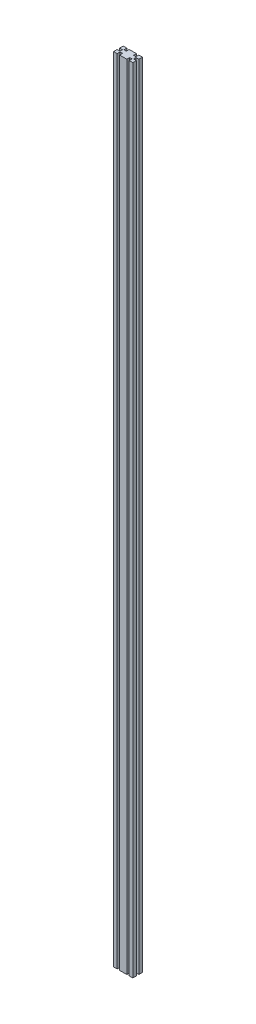
ISO-10303-21;
HEADER;
FILE_DESCRIPTION(('STEP AP214'),'2;1');
FILE_NAME('part.step','',(''),(''),'','','');
FILE_SCHEMA(('AUTOMOTIVE_DESIGN { 1 0 10303 214 1 1 1 1 }'));
ENDSEC;
DATA;
#1=APPLICATION_CONTEXT('core data for automotive mechanical design processes');
#2=APPLICATION_PROTOCOL_DEFINITION('international standard','automotive_design',2000,#1);
#3=PRODUCT_CONTEXT('',#1,'mechanical');
#4=PRODUCT('Part','Part','',(#3));
#5=PRODUCT_RELATED_PRODUCT_CATEGORY('part','',(#4));
#6=PRODUCT_DEFINITION_FORMATION('','',#4);
#7=PRODUCT_DEFINITION_CONTEXT('part definition',#1,'design');
#8=PRODUCT_DEFINITION('design','',#6,#7);
#9=PRODUCT_DEFINITION_SHAPE('','',#8);
#10=(LENGTH_UNIT() NAMED_UNIT(*) SI_UNIT(.MILLI.,.METRE.));
#11=(NAMED_UNIT(*) PLANE_ANGLE_UNIT() SI_UNIT($,.RADIAN.));
#12=(NAMED_UNIT(*) SI_UNIT($,.STERADIAN.) SOLID_ANGLE_UNIT());
#13=UNCERTAINTY_MEASURE_WITH_UNIT(LENGTH_MEASURE(1.E-05),#10,'distance_accuracy_value','');
#14=(GEOMETRIC_REPRESENTATION_CONTEXT(3) GLOBAL_UNCERTAINTY_ASSIGNED_CONTEXT((#13)) GLOBAL_UNIT_ASSIGNED_CONTEXT((#10,
#11,#12)) REPRESENTATION_CONTEXT('',''));
#15=CARTESIAN_POINT('',(0.,0.,0.));
#16=DIRECTION('',(0.,0.,1.));
#17=DIRECTION('',(1.,0.,0.));
#18=AXIS2_PLACEMENT_3D('',#15,#16,#17);
#19=CARTESIAN_POINT('',(20.,-825.5,10.));
#20=DIRECTION('',(1.,0.,0.));
#21=DIRECTION('',(0.,0.,-1.));
#22=AXIS2_PLACEMENT_3D('',#19,#20,#21);
#23=PLANE('',#22);
#24=DIRECTION('',(0.,0.,-1.));
#25=VECTOR('',#24,1.);
#26=CARTESIAN_POINT('',(20.,825.5,10.));
#27=LINE('',#26,#25);
#28=CARTESIAN_POINT('',(20.,825.5,-2.5));
#29=VERTEX_POINT('',#28);
#30=CARTESIAN_POINT('',(20.,825.5,-10.));
#31=VERTEX_POINT('',#30);
#32=EDGE_CURVE('E375',#29,#31,#27,.T.);
#33=ORIENTED_EDGE('',*,*,#32,.F.);
#34=DIRECTION('',(0.,-1.,0.));
#35=VECTOR('',#34,1.);
#36=CARTESIAN_POINT('',(20.,-825.5,-2.5));
#37=LINE('',#36,#35);
#38=CARTESIAN_POINT('',(20.,-825.5,-2.5));
#39=VERTEX_POINT('',#38);
#40=EDGE_CURVE('E357',#29,#39,#37,.T.);
#41=ORIENTED_EDGE('',*,*,#40,.T.);
#42=DIRECTION('',(0.,0.,-1.));
#43=VECTOR('',#42,1.);
#44=CARTESIAN_POINT('',(20.,-825.5,10.));
#45=LINE('',#44,#43);
#46=CARTESIAN_POINT('',(20.,-825.5,-10.));
#47=VERTEX_POINT('',#46);
#48=EDGE_CURVE('E392',#39,#47,#45,.T.);
#49=ORIENTED_EDGE('',*,*,#48,.T.);
#50=DIRECTION('',(0.,1.,0.));
#51=VECTOR('',#50,1.);
#52=CARTESIAN_POINT('',(20.,-825.5,-10.));
#53=LINE('',#52,#51);
#54=EDGE_CURVE('E37',#47,#31,#53,.T.);
#55=ORIENTED_EDGE('',*,*,#54,.T.);
#56=EDGE_LOOP('',(#33,#41,#49,#55));
#57=FACE_BOUND('',#56,.T.);
#58=ADVANCED_FACE('F33',(#57),#23,.T.);
#59=CARTESIAN_POINT('',(-20.,-825.5,10.));
#60=DIRECTION('',(0.,0.,1.));
#61=DIRECTION('',(1.,0.,0.));
#62=AXIS2_PLACEMENT_3D('',#59,#60,#61);
#63=PLANE('',#62);
#64=DIRECTION('',(1.,0.,0.));
#65=VECTOR('',#64,1.);
#66=CARTESIAN_POINT('',(-20.,825.5,10.));
#67=LINE('',#66,#65);
#68=CARTESIAN_POINT('',(-7.5,825.5,10.));
#69=VERTEX_POINT('',#68);
#70=CARTESIAN_POINT('',(7.5,825.5,10.));
#71=VERTEX_POINT('',#70);
#72=EDGE_CURVE('E393',#69,#71,#67,.T.);
#73=ORIENTED_EDGE('',*,*,#72,.F.);
#74=DIRECTION('',(0.,-1.,0.));
#75=VECTOR('',#74,1.);
#76=CARTESIAN_POINT('',(-7.5,-825.5,10.));
#77=LINE('',#76,#75);
#78=CARTESIAN_POINT('',(-7.5,-825.5,10.));
#79=VERTEX_POINT('',#78);
#80=EDGE_CURVE('E372',#69,#79,#77,.T.);
#81=ORIENTED_EDGE('',*,*,#80,.T.);
#82=DIRECTION('',(1.,0.,0.));
#83=VECTOR('',#82,1.);
#84=CARTESIAN_POINT('',(-20.,-825.5,10.));
#85=LINE('',#84,#83);
#86=CARTESIAN_POINT('',(7.5,-825.5,10.));
#87=VERTEX_POINT('',#86);
#88=EDGE_CURVE('E409',#79,#87,#85,.T.);
#89=ORIENTED_EDGE('',*,*,#88,.T.);
#90=DIRECTION('',(0.,-1.,0.));
#91=VECTOR('',#90,1.);
#92=CARTESIAN_POINT('',(7.5,-825.5,10.));
#93=LINE('',#92,#91);
#94=EDGE_CURVE('E352',#71,#87,#93,.T.);
#95=ORIENTED_EDGE('',*,*,#94,.F.);
#96=EDGE_LOOP('',(#73,#81,#89,#95));
#97=FACE_BOUND('',#96,.T.);
#98=ADVANCED_FACE('F493',(#97),#63,.T.);
#99=CARTESIAN_POINT('',(12.5,825.5,10.));
#100=VERTEX_POINT('',#99);
#101=CARTESIAN_POINT('',(20.,825.5,10.));
#102=VERTEX_POINT('',#101);
#103=EDGE_CURVE('E388',#100,#102,#67,.T.);
#104=ORIENTED_EDGE('',*,*,#103,.F.);
#105=DIRECTION('',(0.,-1.,0.));
#106=VECTOR('',#105,1.);
#107=CARTESIAN_POINT('',(12.5,-825.5,10.));
#108=LINE('',#107,#106);
#109=CARTESIAN_POINT('',(12.5,-825.5,10.));
#110=VERTEX_POINT('',#109);
#111=EDGE_CURVE('E236',#100,#110,#108,.T.);
#112=ORIENTED_EDGE('',*,*,#111,.T.);
#113=CARTESIAN_POINT('',(20.,-825.5,10.));
#114=VERTEX_POINT('',#113);
#115=EDGE_CURVE('E406',#110,#114,#85,.T.);
#116=ORIENTED_EDGE('',*,*,#115,.T.);
#117=DIRECTION('',(0.,1.,0.));
#118=VECTOR('',#117,1.);
#119=CARTESIAN_POINT('',(20.,-825.5,10.));
#120=LINE('',#119,#118);
#121=EDGE_CURVE('E11',#114,#102,#120,.T.);
#122=ORIENTED_EDGE('',*,*,#121,.T.);
#123=EDGE_LOOP('',(#104,#112,#116,#122));
#124=FACE_BOUND('',#123,.T.);
#125=ADVANCED_FACE('F497',(#124),#63,.T.);
#126=CARTESIAN_POINT('',(-20.,-825.5,10.));
#127=DIRECTION('',(-1.,0.,0.));
#128=DIRECTION('',(0.,0.,1.));
#129=AXIS2_PLACEMENT_3D('',#126,#127,#128);
#130=PLANE('',#129);
#131=DIRECTION('',(0.,0.,1.));
#132=VECTOR('',#131,1.);
#133=CARTESIAN_POINT('',(-20.,825.5,10.));
#134=LINE('',#133,#132);
#135=CARTESIAN_POINT('',(-20.,825.5,2.5));
#136=VERTEX_POINT('',#135);
#137=CARTESIAN_POINT('',(-20.,825.5,10.));
#138=VERTEX_POINT('',#137);
#139=EDGE_CURVE('E383',#136,#138,#134,.T.);
#140=ORIENTED_EDGE('',*,*,#139,.F.);
#141=DIRECTION('',(0.,-1.,0.));
#142=VECTOR('',#141,1.);
#143=CARTESIAN_POINT('',(-20.,-825.5,2.5));
#144=LINE('',#143,#142);
#145=CARTESIAN_POINT('',(-20.,-825.5,2.5));
#146=VERTEX_POINT('',#145);
#147=EDGE_CURVE('E365',#136,#146,#144,.T.);
#148=ORIENTED_EDGE('',*,*,#147,.T.);
#149=DIRECTION('',(0.,0.,1.));
#150=VECTOR('',#149,1.);
#151=CARTESIAN_POINT('',(-20.,-825.5,10.));
#152=LINE('',#151,#150);
#153=CARTESIAN_POINT('',(-20.,-825.5,10.));
#154=VERTEX_POINT('',#153);
#155=EDGE_CURVE('E401',#146,#154,#152,.T.);
#156=ORIENTED_EDGE('',*,*,#155,.T.);
#157=DIRECTION('',(0.,1.,0.));
#158=VECTOR('',#157,1.);
#159=CARTESIAN_POINT('',(-20.,-825.5,10.));
#160=LINE('',#159,#158);
#161=EDGE_CURVE('E42',#154,#138,#160,.T.);
#162=ORIENTED_EDGE('',*,*,#161,.T.);
#163=EDGE_LOOP('',(#140,#148,#156,#162));
#164=FACE_BOUND('',#163,.T.);
#165=ADVANCED_FACE('F689',(#164),#130,.T.);
#166=CARTESIAN_POINT('',(-20.,-825.5,-10.));
#167=DIRECTION('',(0.,0.,-1.));
#168=DIRECTION('',(-1.,0.,0.));
#169=AXIS2_PLACEMENT_3D('',#166,#167,#168);
#170=PLANE('',#169);
#171=DIRECTION('',(-1.,0.,0.));
#172=VECTOR('',#171,1.);
#173=CARTESIAN_POINT('',(-20.,825.5,-10.));
#174=LINE('',#173,#172);
#175=CARTESIAN_POINT('',(7.5,825.5,-10.));
#176=VERTEX_POINT('',#175);
#177=CARTESIAN_POINT('',(-7.5,825.5,-10.));
#178=VERTEX_POINT('',#177);
#179=EDGE_CURVE('E384',#176,#178,#174,.T.);
#180=ORIENTED_EDGE('',*,*,#179,.F.);
#181=DIRECTION('',(0.,-1.,0.));
#182=VECTOR('',#181,1.);
#183=CARTESIAN_POINT('',(7.5,-825.5,-10.));
#184=LINE('',#183,#182);
#185=CARTESIAN_POINT('',(7.5,-825.5,-10.));
#186=VERTEX_POINT('',#185);
#187=EDGE_CURVE('E362',#176,#186,#184,.T.);
#188=ORIENTED_EDGE('',*,*,#187,.T.);
#189=DIRECTION('',(-1.,0.,0.));
#190=VECTOR('',#189,1.);
#191=CARTESIAN_POINT('',(-20.,-825.5,-10.));
#192=LINE('',#191,#190);
#193=CARTESIAN_POINT('',(-7.5,-825.5,-10.));
#194=VERTEX_POINT('',#193);
#195=EDGE_CURVE('E402',#186,#194,#192,.T.);
#196=ORIENTED_EDGE('',*,*,#195,.T.);
#197=DIRECTION('',(0.,-1.,0.));
#198=VECTOR('',#197,1.);
#199=CARTESIAN_POINT('',(-7.5,-825.5,-10.));
#200=LINE('',#199,#198);
#201=EDGE_CURVE('E345',#178,#194,#200,.T.);
#202=ORIENTED_EDGE('',*,*,#201,.F.);
#203=EDGE_LOOP('',(#180,#188,#196,#202));
#204=FACE_BOUND('',#203,.T.);
#205=ADVANCED_FACE('F475',(#204),#170,.T.);
#206=CARTESIAN_POINT('',(-12.5,825.5,-10.));
#207=VERTEX_POINT('',#206);
#208=CARTESIAN_POINT('',(-20.,825.5,-10.));
#209=VERTEX_POINT('',#208);
#210=EDGE_CURVE('E379',#207,#209,#174,.T.);
#211=ORIENTED_EDGE('',*,*,#210,.F.);
#212=DIRECTION('',(0.,-1.,0.));
#213=VECTOR('',#212,1.);
#214=CARTESIAN_POINT('',(-12.5,-825.5,-10.));
#215=LINE('',#214,#213);
#216=CARTESIAN_POINT('',(-12.5,-825.5,-10.));
#217=VERTEX_POINT('',#216);
#218=EDGE_CURVE('E349',#207,#217,#215,.T.);
#219=ORIENTED_EDGE('',*,*,#218,.T.);
#220=CARTESIAN_POINT('',(-20.,-825.5,-10.));
#221=VERTEX_POINT('',#220);
#222=EDGE_CURVE('E397',#217,#221,#192,.T.);
#223=ORIENTED_EDGE('',*,*,#222,.T.);
#224=DIRECTION('',(0.,1.,0.));
#225=VECTOR('',#224,1.);
#226=CARTESIAN_POINT('',(-20.,-825.5,-10.));
#227=LINE('',#226,#225);
#228=EDGE_CURVE('E412',#221,#209,#227,.T.);
#229=ORIENTED_EDGE('',*,*,#228,.T.);
#230=EDGE_LOOP('',(#211,#219,#223,#229));
#231=FACE_BOUND('',#230,.T.);
#232=ADVANCED_FACE('F457',(#231),#170,.T.);
#233=CARTESIAN_POINT('',(0.,-825.5,0.));
#234=DIRECTION('',(0.,-1.,0.));
#235=DIRECTION('',(0.,0.,-1.));
#236=AXIS2_PLACEMENT_3D('',#233,#234,#235);
#237=PLANE('',#236);
#238=ORIENTED_EDGE('',*,*,#88,.F.);
#239=DIRECTION('',(0.,0.,1.));
#240=VECTOR('',#239,1.);
#241=CARTESIAN_POINT('',(-7.5,-825.5,0.));
#242=LINE('',#241,#240);
#243=CARTESIAN_POINT('',(-7.5,-825.5,4.));
#244=VERTEX_POINT('',#243);
#245=EDGE_CURVE('E266',#244,#79,#242,.T.);
#246=ORIENTED_EDGE('',*,*,#245,.F.);
#247=DIRECTION('',(1.,0.,0.));
#248=VECTOR('',#247,1.);
#249=CARTESIAN_POINT('',(0.,-825.5,4.));
#250=LINE('',#249,#248);
#251=CARTESIAN_POINT('',(-12.5,-825.5,4.));
#252=VERTEX_POINT('',#251);
#253=EDGE_CURVE('E261',#252,#244,#250,.T.);
#254=ORIENTED_EDGE('',*,*,#253,.F.);
#255=DIRECTION('',(0.,0.,1.));
#256=VECTOR('',#255,1.);
#257=CARTESIAN_POINT('',(-12.5,-825.5,0.));
#258=LINE('',#257,#256);
#259=CARTESIAN_POINT('',(-12.5,-825.5,10.));
#260=VERTEX_POINT('',#259);
#261=EDGE_CURVE('E263',#252,#260,#258,.T.);
#262=ORIENTED_EDGE('',*,*,#261,.T.);
#263=EDGE_CURVE('E407',#154,#260,#85,.T.);
#264=ORIENTED_EDGE('',*,*,#263,.F.);
#265=ORIENTED_EDGE('',*,*,#155,.F.);
#266=DIRECTION('',(-1.,0.,0.));
#267=VECTOR('',#266,1.);
#268=CARTESIAN_POINT('',(0.,-825.5,2.5));
#269=LINE('',#268,#267);
#270=CARTESIAN_POINT('',(-14.,-825.5,2.5));
#271=VERTEX_POINT('',#270);
#272=EDGE_CURVE('E285',#271,#146,#269,.T.);
#273=ORIENTED_EDGE('',*,*,#272,.F.);
#274=DIRECTION('',(0.,0.,1.));
#275=VECTOR('',#274,1.);
#276=CARTESIAN_POINT('',(-14.,-825.5,0.));
#277=LINE('',#276,#275);
#278=CARTESIAN_POINT('',(-14.,-825.5,-2.5));
#279=VERTEX_POINT('',#278);
#280=EDGE_CURVE('E287',#279,#271,#277,.T.);
#281=ORIENTED_EDGE('',*,*,#280,.F.);
#282=DIRECTION('',(-1.,0.,0.));
#283=VECTOR('',#282,1.);
#284=CARTESIAN_POINT('',(0.,-825.5,-2.5));
#285=LINE('',#284,#283);
#286=CARTESIAN_POINT('',(-20.,-825.5,-2.5));
#287=VERTEX_POINT('',#286);
#288=EDGE_CURVE('E282',#279,#287,#285,.T.);
#289=ORIENTED_EDGE('',*,*,#288,.T.);
#290=EDGE_CURVE('E403',#221,#287,#152,.T.);
#291=ORIENTED_EDGE('',*,*,#290,.F.);
#292=ORIENTED_EDGE('',*,*,#222,.F.);
#293=DIRECTION('',(0.,0.,-1.));
#294=VECTOR('',#293,1.);
#295=CARTESIAN_POINT('',(-12.5,-825.5,0.));
#296=LINE('',#295,#294);
#297=CARTESIAN_POINT('',(-12.5,-825.5,-4.));
#298=VERTEX_POINT('',#297);
#299=EDGE_CURVE('E340',#298,#217,#296,.T.);
#300=ORIENTED_EDGE('',*,*,#299,.F.);
#301=DIRECTION('',(1.,0.,0.));
#302=VECTOR('',#301,1.);
#303=CARTESIAN_POINT('',(0.,-825.5,-4.));
#304=LINE('',#303,#302);
#305=CARTESIAN_POINT('',(-7.5,-825.5,-4.));
#306=VERTEX_POINT('',#305);
#307=EDGE_CURVE('E334',#298,#306,#304,.T.);
#308=ORIENTED_EDGE('',*,*,#307,.T.);
#309=DIRECTION('',(0.,0.,-1.));
#310=VECTOR('',#309,1.);
#311=CARTESIAN_POINT('',(-7.5,-825.5,0.));
#312=LINE('',#311,#310);
#313=EDGE_CURVE('E337',#306,#194,#312,.T.);
#314=ORIENTED_EDGE('',*,*,#313,.T.);
#315=ORIENTED_EDGE('',*,*,#195,.F.);
#316=DIRECTION('',(0.,0.,-1.));
#317=VECTOR('',#316,1.);
#318=CARTESIAN_POINT('',(7.5,-825.5,0.));
#319=LINE('',#318,#317);
#320=CARTESIAN_POINT('',(7.5,-825.5,-4.));
#321=VERTEX_POINT('',#320);
#322=EDGE_CURVE('E304',#321,#186,#319,.T.);
#323=ORIENTED_EDGE('',*,*,#322,.F.);
#324=DIRECTION('',(-1.,0.,0.));
#325=VECTOR('',#324,1.);
#326=CARTESIAN_POINT('',(0.,-825.5,-4.));
#327=LINE('',#326,#325);
#328=CARTESIAN_POINT('',(12.5,-825.5,-4.));
#329=VERTEX_POINT('',#328);
#330=EDGE_CURVE('E299',#329,#321,#327,.T.);
#331=ORIENTED_EDGE('',*,*,#330,.F.);
#332=DIRECTION('',(0.,0.,-1.));
#333=VECTOR('',#332,1.);
#334=CARTESIAN_POINT('',(12.5,-825.5,0.));
#335=LINE('',#334,#333);
#336=CARTESIAN_POINT('',(12.5,-825.5,-10.));
#337=VERTEX_POINT('',#336);
#338=EDGE_CURVE('E301',#329,#337,#335,.T.);
#339=ORIENTED_EDGE('',*,*,#338,.T.);
#340=EDGE_CURVE('E398',#47,#337,#192,.T.);
#341=ORIENTED_EDGE('',*,*,#340,.F.);
#342=ORIENTED_EDGE('',*,*,#48,.F.);
#343=DIRECTION('',(1.,0.,0.));
#344=VECTOR('',#343,1.);
#345=CARTESIAN_POINT('',(0.,-825.5,-2.5));
#346=LINE('',#345,#344);
#347=CARTESIAN_POINT('',(14.,-825.5,-2.5));
#348=VERTEX_POINT('',#347);
#349=EDGE_CURVE('E316',#348,#39,#346,.T.);
#350=ORIENTED_EDGE('',*,*,#349,.F.);
#351=DIRECTION('',(0.,0.,1.));
#352=VECTOR('',#351,1.);
#353=CARTESIAN_POINT('',(14.,-825.5,0.));
#354=LINE('',#353,#352);
#355=CARTESIAN_POINT('',(14.,-825.5,2.5));
#356=VERTEX_POINT('',#355);
#357=EDGE_CURVE('E318',#348,#356,#354,.T.);
#358=ORIENTED_EDGE('',*,*,#357,.T.);
#359=DIRECTION('',(1.,0.,0.));
#360=VECTOR('',#359,1.);
#361=CARTESIAN_POINT('',(0.,-825.5,2.5));
#362=LINE('',#361,#360);
#363=CARTESIAN_POINT('',(20.,-825.5,2.5));
#364=VERTEX_POINT('',#363);
#365=EDGE_CURVE('E321',#356,#364,#362,.T.);
#366=ORIENTED_EDGE('',*,*,#365,.T.);
#367=EDGE_CURVE('E394',#114,#364,#45,.T.);
#368=ORIENTED_EDGE('',*,*,#367,.F.);
#369=ORIENTED_EDGE('',*,*,#115,.F.);
#370=DIRECTION('',(0.,0.,1.));
#371=VECTOR('',#370,1.);
#372=CARTESIAN_POINT('',(12.5,-825.5,0.));
#373=LINE('',#372,#371);
#374=CARTESIAN_POINT('',(12.5,-825.5,4.));
#375=VERTEX_POINT('',#374);
#376=EDGE_CURVE('E252',#375,#110,#373,.T.);
#377=ORIENTED_EDGE('',*,*,#376,.F.);
#378=DIRECTION('',(-1.,0.,0.));
#379=VECTOR('',#378,1.);
#380=CARTESIAN_POINT('',(0.,-825.5,4.));
#381=LINE('',#380,#379);
#382=CARTESIAN_POINT('',(7.5,-825.5,4.));
#383=VERTEX_POINT('',#382);
#384=EDGE_CURVE('E226',#375,#383,#381,.T.);
#385=ORIENTED_EDGE('',*,*,#384,.T.);
#386=DIRECTION('',(0.,0.,1.));
#387=VECTOR('',#386,1.);
#388=CARTESIAN_POINT('',(7.5,-825.5,0.));
#389=LINE('',#388,#387);
#390=EDGE_CURVE('E249',#383,#87,#389,.T.);
#391=ORIENTED_EDGE('',*,*,#390,.T.);
#392=EDGE_LOOP('',(#238,#246,#254,#262,#264,#265,#273,#281,#289,#291,#292,#300,#308,#314,#315,
#323,#331,#339,#341,#342,#350,#358,#366,#368,#369,#377,#385,#391));
#393=FACE_BOUND('',#392,.T.);
#394=ADVANCED_FACE('F440',(#393),#237,.T.);
#395=CARTESIAN_POINT('',(0.,825.5,0.));
#396=DIRECTION('',(0.,-1.,0.));
#397=DIRECTION('',(0.,0.,-1.));
#398=AXIS2_PLACEMENT_3D('',#395,#396,#397);
#399=PLANE('',#398);
#400=DIRECTION('',(0.,0.,1.));
#401=VECTOR('',#400,1.);
#402=CARTESIAN_POINT('',(-7.5,825.5,0.));
#403=LINE('',#402,#401);
#404=CARTESIAN_POINT('',(-7.5,825.5,4.));
#405=VERTEX_POINT('',#404);
#406=EDGE_CURVE('E259',#405,#69,#403,.T.);
#407=ORIENTED_EDGE('',*,*,#406,.T.);
#408=ORIENTED_EDGE('',*,*,#72,.T.);
#409=DIRECTION('',(0.,0.,1.));
#410=VECTOR('',#409,1.);
#411=CARTESIAN_POINT('',(7.5,825.5,0.));
#412=LINE('',#411,#410);
#413=CARTESIAN_POINT('',(7.5,825.5,4.));
#414=VERTEX_POINT('',#413);
#415=EDGE_CURVE('E239',#414,#71,#412,.T.);
#416=ORIENTED_EDGE('',*,*,#415,.F.);
#417=DIRECTION('',(-1.,0.,0.));
#418=VECTOR('',#417,1.);
#419=CARTESIAN_POINT('',(0.,825.5,4.));
#420=LINE('',#419,#418);
#421=CARTESIAN_POINT('',(12.5,825.5,4.));
#422=VERTEX_POINT('',#421);
#423=EDGE_CURVE('E223',#422,#414,#420,.T.);
#424=ORIENTED_EDGE('',*,*,#423,.F.);
#425=DIRECTION('',(0.,0.,1.));
#426=VECTOR('',#425,1.);
#427=CARTESIAN_POINT('',(12.5,825.5,0.));
#428=LINE('',#427,#426);
#429=EDGE_CURVE('E233',#422,#100,#428,.T.);
#430=ORIENTED_EDGE('',*,*,#429,.T.);
#431=ORIENTED_EDGE('',*,*,#103,.T.);
#432=CARTESIAN_POINT('',(20.,825.5,2.5));
#433=VERTEX_POINT('',#432);
#434=EDGE_CURVE('E376',#102,#433,#27,.T.);
#435=ORIENTED_EDGE('',*,*,#434,.T.);
#436=DIRECTION('',(1.,0.,0.));
#437=VECTOR('',#436,1.);
#438=CARTESIAN_POINT('',(0.,825.5,2.5));
#439=LINE('',#438,#437);
#440=CARTESIAN_POINT('',(14.,825.5,2.5));
#441=VERTEX_POINT('',#440);
#442=EDGE_CURVE('E314',#441,#433,#439,.T.);
#443=ORIENTED_EDGE('',*,*,#442,.F.);
#444=DIRECTION('',(0.,0.,1.));
#445=VECTOR('',#444,1.);
#446=CARTESIAN_POINT('',(14.,825.5,0.));
#447=LINE('',#446,#445);
#448=CARTESIAN_POINT('',(14.,825.5,-2.5));
#449=VERTEX_POINT('',#448);
#450=EDGE_CURVE('E311',#449,#441,#447,.T.);
#451=ORIENTED_EDGE('',*,*,#450,.F.);
#452=DIRECTION('',(1.,0.,0.));
#453=VECTOR('',#452,1.);
#454=CARTESIAN_POINT('',(0.,825.5,-2.5));
#455=LINE('',#454,#453);
#456=EDGE_CURVE('E229',#449,#29,#455,.T.);
#457=ORIENTED_EDGE('',*,*,#456,.T.);
#458=ORIENTED_EDGE('',*,*,#32,.T.);
#459=CARTESIAN_POINT('',(12.5,825.5,-10.));
#460=VERTEX_POINT('',#459);
#461=EDGE_CURVE('E380',#31,#460,#174,.T.);
#462=ORIENTED_EDGE('',*,*,#461,.T.);
#463=DIRECTION('',(0.,0.,-1.));
#464=VECTOR('',#463,1.);
#465=CARTESIAN_POINT('',(12.5,825.5,0.));
#466=LINE('',#465,#464);
#467=CARTESIAN_POINT('',(12.5,825.5,-4.));
#468=VERTEX_POINT('',#467);
#469=EDGE_CURVE('E293',#468,#460,#466,.T.);
#470=ORIENTED_EDGE('',*,*,#469,.F.);
#471=DIRECTION('',(-1.,0.,0.));
#472=VECTOR('',#471,1.);
#473=CARTESIAN_POINT('',(0.,825.5,-4.));
#474=LINE('',#473,#472);
#475=CARTESIAN_POINT('',(7.5,825.5,-4.));
#476=VERTEX_POINT('',#475);
#477=EDGE_CURVE('E58',#468,#476,#474,.T.);
#478=ORIENTED_EDGE('',*,*,#477,.T.);
#479=DIRECTION('',(0.,0.,-1.));
#480=VECTOR('',#479,1.);
#481=CARTESIAN_POINT('',(7.5,825.5,0.));
#482=LINE('',#481,#480);
#483=EDGE_CURVE('E296',#476,#176,#482,.T.);
#484=ORIENTED_EDGE('',*,*,#483,.T.);
#485=ORIENTED_EDGE('',*,*,#179,.T.);
#486=DIRECTION('',(0.,0.,-1.));
#487=VECTOR('',#486,1.);
#488=CARTESIAN_POINT('',(-7.5,825.5,0.));
#489=LINE('',#488,#487);
#490=CARTESIAN_POINT('',(-7.5,825.5,-4.));
#491=VERTEX_POINT('',#490);
#492=EDGE_CURVE('E329',#491,#178,#489,.T.);
#493=ORIENTED_EDGE('',*,*,#492,.F.);
#494=DIRECTION('',(1.,0.,0.));
#495=VECTOR('',#494,1.);
#496=CARTESIAN_POINT('',(0.,825.5,-4.));
#497=LINE('',#496,#495);
#498=CARTESIAN_POINT('',(-12.5,825.5,-4.));
#499=VERTEX_POINT('',#498);
#500=EDGE_CURVE('E271',#499,#491,#497,.T.);
#501=ORIENTED_EDGE('',*,*,#500,.F.);
#502=DIRECTION('',(0.,0.,-1.));
#503=VECTOR('',#502,1.);
#504=CARTESIAN_POINT('',(-12.5,825.5,0.));
#505=LINE('',#504,#503);
#506=EDGE_CURVE('E331',#499,#207,#505,.T.);
#507=ORIENTED_EDGE('',*,*,#506,.T.);
#508=ORIENTED_EDGE('',*,*,#210,.T.);
#509=CARTESIAN_POINT('',(-20.,825.5,-2.5));
#510=VERTEX_POINT('',#509);
#511=EDGE_CURVE('E385',#209,#510,#134,.T.);
#512=ORIENTED_EDGE('',*,*,#511,.T.);
#513=DIRECTION('',(-1.,0.,0.));
#514=VECTOR('',#513,1.);
#515=CARTESIAN_POINT('',(0.,825.5,-2.5));
#516=LINE('',#515,#514);
#517=CARTESIAN_POINT('',(-14.,825.5,-2.5));
#518=VERTEX_POINT('',#517);
#519=EDGE_CURVE('E273',#518,#510,#516,.T.);
#520=ORIENTED_EDGE('',*,*,#519,.F.);
#521=DIRECTION('',(0.,0.,1.));
#522=VECTOR('',#521,1.);
#523=CARTESIAN_POINT('',(-14.,825.5,0.));
#524=LINE('',#523,#522);
#525=CARTESIAN_POINT('',(-14.,825.5,2.5));
#526=VERTEX_POINT('',#525);
#527=EDGE_CURVE('E279',#518,#526,#524,.T.);
#528=ORIENTED_EDGE('',*,*,#527,.T.);
#529=DIRECTION('',(-1.,0.,0.));
#530=VECTOR('',#529,1.);
#531=CARTESIAN_POINT('',(0.,825.5,2.5));
#532=LINE('',#531,#530);
#533=EDGE_CURVE('E275',#526,#136,#532,.T.);
#534=ORIENTED_EDGE('',*,*,#533,.T.);
#535=ORIENTED_EDGE('',*,*,#139,.T.);
#536=CARTESIAN_POINT('',(-12.5,825.5,10.));
#537=VERTEX_POINT('',#536);
#538=EDGE_CURVE('E389',#138,#537,#67,.T.);
#539=ORIENTED_EDGE('',*,*,#538,.T.);
#540=DIRECTION('',(0.,0.,1.));
#541=VECTOR('',#540,1.);
#542=CARTESIAN_POINT('',(-12.5,825.5,0.));
#543=LINE('',#542,#541);
#544=CARTESIAN_POINT('',(-12.5,825.5,4.));
#545=VERTEX_POINT('',#544);
#546=EDGE_CURVE('E256',#545,#537,#543,.T.);
#547=ORIENTED_EDGE('',*,*,#546,.F.);
#548=DIRECTION('',(1.,0.,0.));
#549=VECTOR('',#548,1.);
#550=CARTESIAN_POINT('',(0.,825.5,4.));
#551=LINE('',#550,#549);
#552=EDGE_CURVE('E50',#545,#405,#551,.T.);
#553=ORIENTED_EDGE('',*,*,#552,.T.);
#554=EDGE_LOOP('',(#407,#408,#416,#424,#430,#431,#435,#443,#451,#457,#458,#462,#470,#478,#484,
#485,#493,#501,#507,#508,#512,#520,#528,#534,#535,#539,#547,#553));
#555=FACE_BOUND('',#554,.T.);
#556=ADVANCED_FACE('F243',(#555),#399,.F.);
#557=DIRECTION('',(0.,-1.,0.));
#558=VECTOR('',#557,1.);
#559=CARTESIAN_POINT('',(20.,-825.5,2.5));
#560=LINE('',#559,#558);
#561=EDGE_CURVE('E355',#433,#364,#560,.T.);
#562=ORIENTED_EDGE('',*,*,#561,.F.);
#563=ORIENTED_EDGE('',*,*,#434,.F.);
#564=ORIENTED_EDGE('',*,*,#121,.F.);
#565=ORIENTED_EDGE('',*,*,#367,.T.);
#566=EDGE_LOOP('',(#562,#563,#564,#565));
#567=FACE_BOUND('',#566,.T.);
#568=ADVANCED_FACE('F35',(#567),#23,.T.);
#569=DIRECTION('',(0.,-1.,0.));
#570=VECTOR('',#569,1.);
#571=CARTESIAN_POINT('',(-12.5,-825.5,10.));
#572=LINE('',#571,#570);
#573=EDGE_CURVE('E370',#537,#260,#572,.T.);
#574=ORIENTED_EDGE('',*,*,#573,.F.);
#575=ORIENTED_EDGE('',*,*,#538,.F.);
#576=ORIENTED_EDGE('',*,*,#161,.F.);
#577=ORIENTED_EDGE('',*,*,#263,.T.);
#578=EDGE_LOOP('',(#574,#575,#576,#577));
#579=FACE_BOUND('',#578,.T.);
#580=ADVANCED_FACE('F500',(#579),#63,.T.);
#581=DIRECTION('',(0.,-1.,0.));
#582=VECTOR('',#581,1.);
#583=CARTESIAN_POINT('',(-20.,-825.5,-2.5));
#584=LINE('',#583,#582);
#585=EDGE_CURVE('E368',#510,#287,#584,.T.);
#586=ORIENTED_EDGE('',*,*,#585,.F.);
#587=ORIENTED_EDGE('',*,*,#511,.F.);
#588=ORIENTED_EDGE('',*,*,#228,.F.);
#589=ORIENTED_EDGE('',*,*,#290,.T.);
#590=EDGE_LOOP('',(#586,#587,#588,#589));
#591=FACE_BOUND('',#590,.T.);
#592=ADVANCED_FACE('F462',(#591),#130,.T.);
#593=DIRECTION('',(0.,-1.,0.));
#594=VECTOR('',#593,1.);
#595=CARTESIAN_POINT('',(12.5,-825.5,-10.));
#596=LINE('',#595,#594);
#597=EDGE_CURVE('E360',#460,#337,#596,.T.);
#598=ORIENTED_EDGE('',*,*,#597,.F.);
#599=ORIENTED_EDGE('',*,*,#461,.F.);
#600=ORIENTED_EDGE('',*,*,#54,.F.);
#601=ORIENTED_EDGE('',*,*,#340,.T.);
#602=EDGE_LOOP('',(#598,#599,#600,#601));
#603=FACE_BOUND('',#602,.T.);
#604=ADVANCED_FACE('F427',(#603),#170,.T.);
#605=CARTESIAN_POINT('',(0.,-825.5,-4.));
#606=DIRECTION('',(0.,0.,1.));
#607=DIRECTION('',(1.,0.,0.));
#608=AXIS2_PLACEMENT_3D('',#605,#606,#607);
#609=PLANE('',#608);
#610=DIRECTION('',(0.,1.,0.));
#611=VECTOR('',#610,1.);
#612=CARTESIAN_POINT('',(-7.5,-825.5,-4.));
#613=LINE('',#612,#611);
#614=EDGE_CURVE('E342',#306,#491,#613,.T.);
#615=ORIENTED_EDGE('',*,*,#614,.F.);
#616=ORIENTED_EDGE('',*,*,#307,.F.);
#617=DIRECTION('',(0.,1.,0.));
#618=VECTOR('',#617,1.);
#619=CARTESIAN_POINT('',(-12.5,-825.5,-4.));
#620=LINE('',#619,#618);
#621=EDGE_CURVE('E343',#298,#499,#620,.T.);
#622=ORIENTED_EDGE('',*,*,#621,.T.);
#623=ORIENTED_EDGE('',*,*,#500,.T.);
#624=EDGE_LOOP('',(#615,#616,#622,#623));
#625=FACE_BOUND('',#624,.T.);
#626=ADVANCED_FACE('F480',(#625),#609,.F.);
#627=CARTESIAN_POINT('',(-12.5,-825.5,0.));
#628=DIRECTION('',(1.,0.,0.));
#629=DIRECTION('',(0.,0.,-1.));
#630=AXIS2_PLACEMENT_3D('',#627,#628,#629);
#631=PLANE('',#630);
#632=ORIENTED_EDGE('',*,*,#506,.F.);
#633=ORIENTED_EDGE('',*,*,#621,.F.);
#634=ORIENTED_EDGE('',*,*,#299,.T.);
#635=ORIENTED_EDGE('',*,*,#218,.F.);
#636=EDGE_LOOP('',(#632,#633,#634,#635));
#637=FACE_BOUND('',#636,.T.);
#638=ADVANCED_FACE('F482',(#637),#631,.T.);
#639=CARTESIAN_POINT('',(-7.5,-825.5,0.));
#640=DIRECTION('',(1.,0.,0.));
#641=DIRECTION('',(0.,0.,-1.));
#642=AXIS2_PLACEMENT_3D('',#639,#640,#641);
#643=PLANE('',#642);
#644=ORIENTED_EDGE('',*,*,#201,.T.);
#645=ORIENTED_EDGE('',*,*,#313,.F.);
#646=ORIENTED_EDGE('',*,*,#614,.T.);
#647=ORIENTED_EDGE('',*,*,#492,.T.);
#648=EDGE_LOOP('',(#644,#645,#646,#647));
#649=FACE_BOUND('',#648,.T.);
#650=ADVANCED_FACE('F477',(#649),#643,.F.);
#651=CARTESIAN_POINT('',(0.,-825.5,4.));
#652=DIRECTION('',(0.,0.,-1.));
#653=DIRECTION('',(-1.,0.,0.));
#654=AXIS2_PLACEMENT_3D('',#651,#652,#653);
#655=PLANE('',#654);
#656=DIRECTION('',(0.,1.,0.));
#657=VECTOR('',#656,1.);
#658=CARTESIAN_POINT('',(7.5,-825.5,4.));
#659=LINE('',#658,#657);
#660=EDGE_CURVE('E230',#383,#414,#659,.T.);
#661=ORIENTED_EDGE('',*,*,#660,.F.);
#662=ORIENTED_EDGE('',*,*,#384,.F.);
#663=DIRECTION('',(0.,1.,0.));
#664=VECTOR('',#663,1.);
#665=CARTESIAN_POINT('',(12.5,-825.5,4.));
#666=LINE('',#665,#664);
#667=EDGE_CURVE('E219',#375,#422,#666,.T.);
#668=ORIENTED_EDGE('',*,*,#667,.T.);
#669=ORIENTED_EDGE('',*,*,#423,.T.);
#670=EDGE_LOOP('',(#661,#662,#668,#669));
#671=FACE_BOUND('',#670,.T.);
#672=ADVANCED_FACE('F221',(#671),#655,.F.);
#673=CARTESIAN_POINT('',(12.5,-825.5,0.));
#674=DIRECTION('',(-1.,0.,0.));
#675=DIRECTION('',(0.,0.,1.));
#676=AXIS2_PLACEMENT_3D('',#673,#674,#675);
#677=PLANE('',#676);
#678=ORIENTED_EDGE('',*,*,#429,.F.);
#679=ORIENTED_EDGE('',*,*,#667,.F.);
#680=ORIENTED_EDGE('',*,*,#376,.T.);
#681=ORIENTED_EDGE('',*,*,#111,.F.);
#682=EDGE_LOOP('',(#678,#679,#680,#681));
#683=FACE_BOUND('',#682,.T.);
#684=ADVANCED_FACE('F234',(#683),#677,.T.);
#685=CARTESIAN_POINT('',(7.5,-825.5,0.));
#686=DIRECTION('',(-1.,0.,0.));
#687=DIRECTION('',(0.,0.,1.));
#688=AXIS2_PLACEMENT_3D('',#685,#686,#687);
#689=PLANE('',#688);
#690=ORIENTED_EDGE('',*,*,#94,.T.);
#691=ORIENTED_EDGE('',*,*,#390,.F.);
#692=ORIENTED_EDGE('',*,*,#660,.T.);
#693=ORIENTED_EDGE('',*,*,#415,.T.);
#694=EDGE_LOOP('',(#690,#691,#692,#693));
#695=FACE_BOUND('',#694,.T.);
#696=ADVANCED_FACE('F524',(#695),#689,.F.);
#697=CARTESIAN_POINT('',(0.,-825.5,-2.5));
#698=DIRECTION('',(0.,0.,1.));
#699=DIRECTION('',(1.,0.,0.));
#700=AXIS2_PLACEMENT_3D('',#697,#698,#699);
#701=PLANE('',#700);
#702=ORIENTED_EDGE('',*,*,#456,.F.);
#703=DIRECTION('',(0.,1.,0.));
#704=VECTOR('',#703,1.);
#705=CARTESIAN_POINT('',(14.,-825.5,-2.5));
#706=LINE('',#705,#704);
#707=EDGE_CURVE('E324',#348,#449,#706,.T.);
#708=ORIENTED_EDGE('',*,*,#707,.F.);
#709=ORIENTED_EDGE('',*,*,#349,.T.);
#710=ORIENTED_EDGE('',*,*,#40,.F.);
#711=EDGE_LOOP('',(#702,#708,#709,#710));
#712=FACE_BOUND('',#711,.T.);
#713=ADVANCED_FACE('F432',(#712),#701,.T.);
#714=CARTESIAN_POINT('',(0.,-825.5,2.5));
#715=DIRECTION('',(0.,0.,1.));
#716=DIRECTION('',(1.,0.,0.));
#717=AXIS2_PLACEMENT_3D('',#714,#715,#716);
#718=PLANE('',#717);
#719=ORIENTED_EDGE('',*,*,#561,.T.);
#720=ORIENTED_EDGE('',*,*,#365,.F.);
#721=DIRECTION('',(0.,1.,0.));
#722=VECTOR('',#721,1.);
#723=CARTESIAN_POINT('',(14.,-825.5,2.5));
#724=LINE('',#723,#722);
#725=EDGE_CURVE('E294',#356,#441,#724,.T.);
#726=ORIENTED_EDGE('',*,*,#725,.T.);
#727=ORIENTED_EDGE('',*,*,#442,.T.);
#728=EDGE_LOOP('',(#719,#720,#726,#727));
#729=FACE_BOUND('',#728,.T.);
#730=ADVANCED_FACE('F516',(#729),#718,.F.);
#731=CARTESIAN_POINT('',(14.,-825.5,0.));
#732=DIRECTION('',(-1.,0.,0.));
#733=DIRECTION('',(0.,0.,1.));
#734=AXIS2_PLACEMENT_3D('',#731,#732,#733);
#735=PLANE('',#734);
#736=ORIENTED_EDGE('',*,*,#725,.F.);
#737=ORIENTED_EDGE('',*,*,#357,.F.);
#738=ORIENTED_EDGE('',*,*,#707,.T.);
#739=ORIENTED_EDGE('',*,*,#450,.T.);
#740=EDGE_LOOP('',(#736,#737,#738,#739));
#741=FACE_BOUND('',#740,.T.);
#742=ADVANCED_FACE('F435',(#741),#735,.F.);
#743=CARTESIAN_POINT('',(0.,-825.5,-4.));
#744=DIRECTION('',(0.,0.,-1.));
#745=DIRECTION('',(-1.,0.,0.));
#746=AXIS2_PLACEMENT_3D('',#743,#744,#745);
#747=PLANE('',#746);
#748=DIRECTION('',(0.,1.,0.));
#749=VECTOR('',#748,1.);
#750=CARTESIAN_POINT('',(12.5,-825.5,-4.));
#751=LINE('',#750,#749);
#752=EDGE_CURVE('E306',#329,#468,#751,.T.);
#753=ORIENTED_EDGE('',*,*,#752,.F.);
#754=ORIENTED_EDGE('',*,*,#330,.T.);
#755=DIRECTION('',(0.,1.,0.));
#756=VECTOR('',#755,1.);
#757=CARTESIAN_POINT('',(7.5,-825.5,-4.));
#758=LINE('',#757,#756);
#759=EDGE_CURVE('E276',#321,#476,#758,.T.);
#760=ORIENTED_EDGE('',*,*,#759,.T.);
#761=ORIENTED_EDGE('',*,*,#477,.F.);
#762=EDGE_LOOP('',(#753,#754,#760,#761));
#763=FACE_BOUND('',#762,.T.);
#764=ADVANCED_FACE('F446',(#763),#747,.T.);
#765=CARTESIAN_POINT('',(7.5,-825.5,0.));
#766=DIRECTION('',(1.,0.,0.));
#767=DIRECTION('',(0.,0.,-1.));
#768=AXIS2_PLACEMENT_3D('',#765,#766,#767);
#769=PLANE('',#768);
#770=ORIENTED_EDGE('',*,*,#483,.F.);
#771=ORIENTED_EDGE('',*,*,#759,.F.);
#772=ORIENTED_EDGE('',*,*,#322,.T.);
#773=ORIENTED_EDGE('',*,*,#187,.F.);
#774=EDGE_LOOP('',(#770,#771,#772,#773));
#775=FACE_BOUND('',#774,.T.);
#776=ADVANCED_FACE('F450',(#775),#769,.T.);
#777=CARTESIAN_POINT('',(12.5,-825.5,0.));
#778=DIRECTION('',(1.,0.,0.));
#779=DIRECTION('',(0.,0.,-1.));
#780=AXIS2_PLACEMENT_3D('',#777,#778,#779);
#781=PLANE('',#780);
#782=ORIENTED_EDGE('',*,*,#597,.T.);
#783=ORIENTED_EDGE('',*,*,#338,.F.);
#784=ORIENTED_EDGE('',*,*,#752,.T.);
#785=ORIENTED_EDGE('',*,*,#469,.T.);
#786=EDGE_LOOP('',(#782,#783,#784,#785));
#787=FACE_BOUND('',#786,.T.);
#788=ADVANCED_FACE('F445',(#787),#781,.F.);
#789=CARTESIAN_POINT('',(0.,-825.5,-2.5));
#790=DIRECTION('',(0.,0.,-1.));
#791=DIRECTION('',(-1.,0.,0.));
#792=AXIS2_PLACEMENT_3D('',#789,#790,#791);
#793=PLANE('',#792);
#794=ORIENTED_EDGE('',*,*,#585,.T.);
#795=ORIENTED_EDGE('',*,*,#288,.F.);
#796=DIRECTION('',(0.,1.,0.));
#797=VECTOR('',#796,1.);
#798=CARTESIAN_POINT('',(-14.,-825.5,-2.5));
#799=LINE('',#798,#797);
#800=EDGE_CURVE('E257',#279,#518,#799,.T.);
#801=ORIENTED_EDGE('',*,*,#800,.T.);
#802=ORIENTED_EDGE('',*,*,#519,.T.);
#803=EDGE_LOOP('',(#794,#795,#801,#802));
#804=FACE_BOUND('',#803,.T.);
#805=ADVANCED_FACE('F467',(#804),#793,.F.);
#806=CARTESIAN_POINT('',(-14.,-825.5,0.));
#807=DIRECTION('',(-1.,0.,0.));
#808=DIRECTION('',(0.,0.,1.));
#809=AXIS2_PLACEMENT_3D('',#806,#807,#808);
#810=PLANE('',#809);
#811=ORIENTED_EDGE('',*,*,#800,.F.);
#812=ORIENTED_EDGE('',*,*,#280,.T.);
#813=DIRECTION('',(0.,1.,0.));
#814=VECTOR('',#813,1.);
#815=CARTESIAN_POINT('',(-14.,-825.5,2.5));
#816=LINE('',#815,#814);
#817=EDGE_CURVE('E289',#271,#526,#816,.T.);
#818=ORIENTED_EDGE('',*,*,#817,.T.);
#819=ORIENTED_EDGE('',*,*,#527,.F.);
#820=EDGE_LOOP('',(#811,#812,#818,#819));
#821=FACE_BOUND('',#820,.T.);
#822=ADVANCED_FACE('F534',(#821),#810,.T.);
#823=CARTESIAN_POINT('',(0.,-825.5,2.5));
#824=DIRECTION('',(0.,0.,-1.));
#825=DIRECTION('',(-1.,0.,0.));
#826=AXIS2_PLACEMENT_3D('',#823,#824,#825);
#827=PLANE('',#826);
#828=ORIENTED_EDGE('',*,*,#533,.F.);
#829=ORIENTED_EDGE('',*,*,#817,.F.);
#830=ORIENTED_EDGE('',*,*,#272,.T.);
#831=ORIENTED_EDGE('',*,*,#147,.F.);
#832=EDGE_LOOP('',(#828,#829,#830,#831));
#833=FACE_BOUND('',#832,.T.);
#834=ADVANCED_FACE('F535',(#833),#827,.T.);
#835=CARTESIAN_POINT('',(0.,-825.5,4.));
#836=DIRECTION('',(0.,0.,1.));
#837=DIRECTION('',(1.,0.,0.));
#838=AXIS2_PLACEMENT_3D('',#835,#836,#837);
#839=PLANE('',#838);
#840=DIRECTION('',(0.,1.,0.));
#841=VECTOR('',#840,1.);
#842=CARTESIAN_POINT('',(-12.5,-825.5,4.));
#843=LINE('',#842,#841);
#844=EDGE_CURVE('E268',#252,#545,#843,.T.);
#845=ORIENTED_EDGE('',*,*,#844,.F.);
#846=ORIENTED_EDGE('',*,*,#253,.T.);
#847=DIRECTION('',(0.,1.,0.));
#848=VECTOR('',#847,1.);
#849=CARTESIAN_POINT('',(-7.5,-825.5,4.));
#850=LINE('',#849,#848);
#851=EDGE_CURVE('E269',#244,#405,#850,.T.);
#852=ORIENTED_EDGE('',*,*,#851,.T.);
#853=ORIENTED_EDGE('',*,*,#552,.F.);
#854=EDGE_LOOP('',(#845,#846,#852,#853));
#855=FACE_BOUND('',#854,.T.);
#856=ADVANCED_FACE('F538',(#855),#839,.T.);
#857=CARTESIAN_POINT('',(-7.5,-825.5,0.));
#858=DIRECTION('',(-1.,0.,0.));
#859=DIRECTION('',(0.,0.,1.));
#860=AXIS2_PLACEMENT_3D('',#857,#858,#859);
#861=PLANE('',#860);
#862=ORIENTED_EDGE('',*,*,#406,.F.);
#863=ORIENTED_EDGE('',*,*,#851,.F.);
#864=ORIENTED_EDGE('',*,*,#245,.T.);
#865=ORIENTED_EDGE('',*,*,#80,.F.);
#866=EDGE_LOOP('',(#862,#863,#864,#865));
#867=FACE_BOUND('',#866,.T.);
#868=ADVANCED_FACE('F545',(#867),#861,.T.);
#869=CARTESIAN_POINT('',(-12.5,-825.5,0.));
#870=DIRECTION('',(-1.,0.,0.));
#871=DIRECTION('',(0.,0.,1.));
#872=AXIS2_PLACEMENT_3D('',#869,#870,#871);
#873=PLANE('',#872);
#874=ORIENTED_EDGE('',*,*,#573,.T.);
#875=ORIENTED_EDGE('',*,*,#261,.F.);
#876=ORIENTED_EDGE('',*,*,#844,.T.);
#877=ORIENTED_EDGE('',*,*,#546,.T.);
#878=EDGE_LOOP('',(#874,#875,#876,#877));
#879=FACE_BOUND('',#878,.T.);
#880=ADVANCED_FACE('F546',(#879),#873,.F.);
#881=CLOSED_SHELL('',(#58,#98,#125,#165,#205,#232,#394,#556,#568,#580,#592,#604,#626,#638,#650,
#672,#684,#696,#713,#730,#742,#764,#776,#788,#805,#822,#834,#856,#868,#880));
#882=MANIFOLD_SOLID_BREP('B2',#881);
#883=ADVANCED_BREP_SHAPE_REPRESENTATION('',(#18,#882),#14);
#884=SHAPE_DEFINITION_REPRESENTATION(#9,#883);
ENDSEC;
END-ISO-10303-21;
